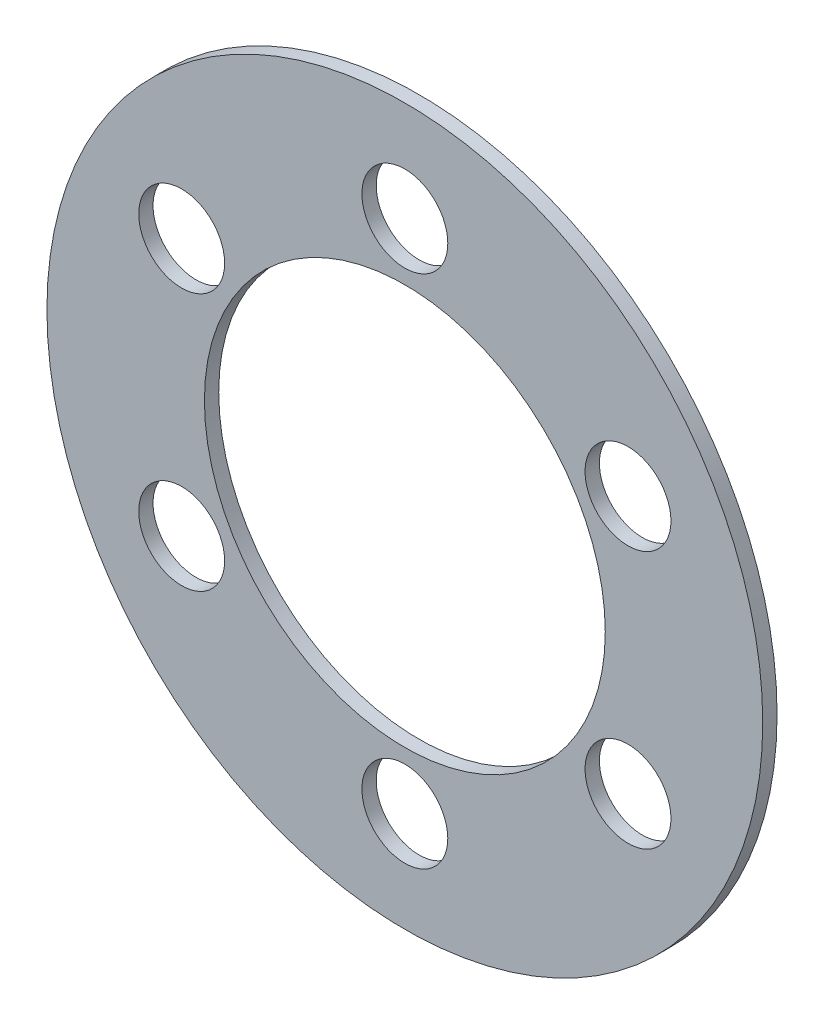
ISO-10303-21;
HEADER;
FILE_DESCRIPTION(('STEP AP214'),'2;1');
FILE_NAME('part.step','',(''),(''),'','','');
FILE_SCHEMA(('AUTOMOTIVE_DESIGN { 1 0 10303 214 1 1 1 1 }'));
ENDSEC;
DATA;
#1=APPLICATION_CONTEXT('core data for automotive mechanical design processes');
#2=APPLICATION_PROTOCOL_DEFINITION('international standard','automotive_design',2000,#1);
#3=PRODUCT_CONTEXT('',#1,'mechanical');
#4=PRODUCT('Part','Part','',(#3));
#5=PRODUCT_RELATED_PRODUCT_CATEGORY('part','',(#4));
#6=PRODUCT_DEFINITION_FORMATION('','',#4);
#7=PRODUCT_DEFINITION_CONTEXT('part definition',#1,'design');
#8=PRODUCT_DEFINITION('design','',#6,#7);
#9=PRODUCT_DEFINITION_SHAPE('','',#8);
#10=(LENGTH_UNIT() NAMED_UNIT(*) SI_UNIT(.MILLI.,.METRE.));
#11=(NAMED_UNIT(*) PLANE_ANGLE_UNIT() SI_UNIT($,.RADIAN.));
#12=(NAMED_UNIT(*) SI_UNIT($,.STERADIAN.) SOLID_ANGLE_UNIT());
#13=UNCERTAINTY_MEASURE_WITH_UNIT(LENGTH_MEASURE(1.E-05),#10,'distance_accuracy_value','');
#14=(GEOMETRIC_REPRESENTATION_CONTEXT(3) GLOBAL_UNCERTAINTY_ASSIGNED_CONTEXT((#13)) GLOBAL_UNIT_ASSIGNED_CONTEXT((#10,
#11,#12)) REPRESENTATION_CONTEXT('',''));
#15=CARTESIAN_POINT('',(0.,0.,0.));
#16=DIRECTION('',(0.,0.,1.));
#17=DIRECTION('',(1.,0.,0.));
#18=AXIS2_PLACEMENT_3D('',#15,#16,#17);
#19=CARTESIAN_POINT('',(0.,0.,0.5));
#20=DIRECTION('',(0.,0.,1.));
#21=DIRECTION('',(1.,0.,0.));
#22=AXIS2_PLACEMENT_3D('',#19,#20,#21);
#23=PLANE('',#22);
#24=CARTESIAN_POINT('',(-7.79422863405994,-4.5,0.5));
#25=DIRECTION('',(0.,0.,1.));
#26=DIRECTION('',(1.,0.,0.));
#27=AXIS2_PLACEMENT_3D('',#24,#25,#26);
#28=CIRCLE('',#27,1.50000000000008);
#29=CARTESIAN_POINT('',(-6.29422863405986,-4.5,0.5));
#30=VERTEX_POINT('',#29);
#31=EDGE_CURVE('E75',#30,#30,#28,.T.);
#32=ORIENTED_EDGE('',*,*,#31,.F.);
#33=EDGE_LOOP('',(#32));
#34=FACE_BOUND('',#33,.T.);
#35=CARTESIAN_POINT('',(7.79422863405995,-4.5,0.5));
#36=DIRECTION('',(0.,0.,1.));
#37=DIRECTION('',(1.,0.,0.));
#38=AXIS2_PLACEMENT_3D('',#35,#36,#37);
#39=CIRCLE('',#38,1.50000000000004);
#40=CARTESIAN_POINT('',(9.29422863405999,-4.5,0.5));
#41=VERTEX_POINT('',#40);
#42=EDGE_CURVE('E63',#41,#41,#39,.T.);
#43=ORIENTED_EDGE('',*,*,#42,.F.);
#44=EDGE_LOOP('',(#43));
#45=FACE_BOUND('',#44,.T.);
#46=CARTESIAN_POINT('',(0.,9.,0.5));
#47=DIRECTION('',(0.,0.,1.));
#48=DIRECTION('',(1.,0.,0.));
#49=AXIS2_PLACEMENT_3D('',#46,#47,#48);
#50=CIRCLE('',#49,1.5);
#51=CARTESIAN_POINT('',(1.5,9.,0.5));
#52=VERTEX_POINT('',#51);
#53=EDGE_CURVE('E51',#52,#52,#50,.T.);
#54=ORIENTED_EDGE('',*,*,#53,.F.);
#55=EDGE_LOOP('',(#54));
#56=FACE_BOUND('',#55,.T.);
#57=CARTESIAN_POINT('',(0.,0.,0.5));
#58=DIRECTION('',(0.,0.,1.));
#59=DIRECTION('',(1.,0.,0.));
#60=AXIS2_PLACEMENT_3D('',#57,#58,#59);
#61=CIRCLE('',#60,12.5);
#62=CARTESIAN_POINT('',(12.5,0.,0.5));
#63=VERTEX_POINT('',#62);
#64=EDGE_CURVE('E10',#63,#63,#61,.T.);
#65=ORIENTED_EDGE('',*,*,#64,.T.);
#66=EDGE_LOOP('',(#65));
#67=FACE_BOUND('',#66,.T.);
#68=CARTESIAN_POINT('',(0.,0.,0.5));
#69=DIRECTION('',(0.,0.,1.));
#70=DIRECTION('',(1.,0.,0.));
#71=AXIS2_PLACEMENT_3D('',#68,#69,#70);
#72=CIRCLE('',#71,7.);
#73=CARTESIAN_POINT('',(7.,0.,0.5));
#74=VERTEX_POINT('',#73);
#75=EDGE_CURVE('E46',#74,#74,#72,.T.);
#76=ORIENTED_EDGE('',*,*,#75,.F.);
#77=EDGE_LOOP('',(#76));
#78=FACE_BOUND('',#77,.T.);
#79=CARTESIAN_POINT('',(7.79422863405995,4.5,0.5));
#80=DIRECTION('',(0.,0.,1.));
#81=DIRECTION('',(1.,0.,0.));
#82=AXIS2_PLACEMENT_3D('',#79,#80,#81);
#83=CIRCLE('',#82,1.50000000000002);
#84=CARTESIAN_POINT('',(9.29422863405997,4.5,0.5));
#85=VERTEX_POINT('',#84);
#86=EDGE_CURVE('E57',#85,#85,#83,.T.);
#87=ORIENTED_EDGE('',*,*,#86,.F.);
#88=EDGE_LOOP('',(#87));
#89=FACE_BOUND('',#88,.T.);
#90=CARTESIAN_POINT('',(0.,-9.,0.5));
#91=DIRECTION('',(0.,0.,1.));
#92=DIRECTION('',(1.,0.,0.));
#93=AXIS2_PLACEMENT_3D('',#90,#91,#92);
#94=CIRCLE('',#93,1.50000000000006);
#95=CARTESIAN_POINT('',(1.50000000000006,-9.,0.5));
#96=VERTEX_POINT('',#95);
#97=EDGE_CURVE('E69',#96,#96,#94,.T.);
#98=ORIENTED_EDGE('',*,*,#97,.F.);
#99=EDGE_LOOP('',(#98));
#100=FACE_BOUND('',#99,.T.);
#101=CARTESIAN_POINT('',(-7.79422863405995,4.49999999999999,0.5));
#102=DIRECTION('',(0.,0.,1.));
#103=DIRECTION('',(1.,0.,0.));
#104=AXIS2_PLACEMENT_3D('',#101,#102,#103);
#105=CIRCLE('',#104,1.50000000000011);
#106=CARTESIAN_POINT('',(-6.29422863405984,4.49999999999999,0.5));
#107=VERTEX_POINT('',#106);
#108=EDGE_CURVE('E81',#107,#107,#105,.T.);
#109=ORIENTED_EDGE('',*,*,#108,.F.);
#110=EDGE_LOOP('',(#109));
#111=FACE_BOUND('',#110,.T.);
#112=ADVANCED_FACE('F35',(#34,#45,#56,#67,#78,#89,#100,#111),#23,.T.);
#113=CARTESIAN_POINT('',(0.,0.,0.));
#114=DIRECTION('',(0.,0.,1.));
#115=DIRECTION('',(1.,0.,0.));
#116=AXIS2_PLACEMENT_3D('',#113,#114,#115);
#117=PLANE('',#116);
#118=CARTESIAN_POINT('',(0.,0.,0.));
#119=DIRECTION('',(0.,0.,1.));
#120=DIRECTION('',(1.,0.,0.));
#121=AXIS2_PLACEMENT_3D('',#118,#119,#120);
#122=CIRCLE('',#121,12.5);
#123=CARTESIAN_POINT('',(12.5,0.,0.));
#124=VERTEX_POINT('',#123);
#125=EDGE_CURVE('E39',#124,#124,#122,.T.);
#126=ORIENTED_EDGE('',*,*,#125,.F.);
#127=EDGE_LOOP('',(#126));
#128=FACE_BOUND('',#127,.T.);
#129=CARTESIAN_POINT('',(0.,0.,0.));
#130=DIRECTION('',(0.,0.,1.));
#131=DIRECTION('',(1.,0.,0.));
#132=AXIS2_PLACEMENT_3D('',#129,#130,#131);
#133=CIRCLE('',#132,7.);
#134=CARTESIAN_POINT('',(7.,0.,0.));
#135=VERTEX_POINT('',#134);
#136=EDGE_CURVE('E48',#135,#135,#133,.T.);
#137=ORIENTED_EDGE('',*,*,#136,.T.);
#138=EDGE_LOOP('',(#137));
#139=FACE_BOUND('',#138,.T.);
#140=CARTESIAN_POINT('',(0.,9.,0.));
#141=DIRECTION('',(0.,0.,1.));
#142=DIRECTION('',(1.,0.,0.));
#143=AXIS2_PLACEMENT_3D('',#140,#141,#142);
#144=CIRCLE('',#143,1.5);
#145=CARTESIAN_POINT('',(1.5,9.,0.));
#146=VERTEX_POINT('',#145);
#147=EDGE_CURVE('E54',#146,#146,#144,.T.);
#148=ORIENTED_EDGE('',*,*,#147,.T.);
#149=EDGE_LOOP('',(#148));
#150=FACE_BOUND('',#149,.T.);
#151=CARTESIAN_POINT('',(7.79422863405995,4.5,0.));
#152=DIRECTION('',(0.,0.,1.));
#153=DIRECTION('',(1.,0.,0.));
#154=AXIS2_PLACEMENT_3D('',#151,#152,#153);
#155=CIRCLE('',#154,1.50000000000002);
#156=CARTESIAN_POINT('',(9.29422863405997,4.5,0.));
#157=VERTEX_POINT('',#156);
#158=EDGE_CURVE('E60',#157,#157,#155,.T.);
#159=ORIENTED_EDGE('',*,*,#158,.T.);
#160=EDGE_LOOP('',(#159));
#161=FACE_BOUND('',#160,.T.);
#162=CARTESIAN_POINT('',(7.79422863405995,-4.5,0.));
#163=DIRECTION('',(0.,0.,1.));
#164=DIRECTION('',(1.,0.,0.));
#165=AXIS2_PLACEMENT_3D('',#162,#163,#164);
#166=CIRCLE('',#165,1.50000000000004);
#167=CARTESIAN_POINT('',(9.29422863405999,-4.5,0.));
#168=VERTEX_POINT('',#167);
#169=EDGE_CURVE('E66',#168,#168,#166,.T.);
#170=ORIENTED_EDGE('',*,*,#169,.T.);
#171=EDGE_LOOP('',(#170));
#172=FACE_BOUND('',#171,.T.);
#173=CARTESIAN_POINT('',(0.,-9.,0.));
#174=DIRECTION('',(0.,0.,1.));
#175=DIRECTION('',(1.,0.,0.));
#176=AXIS2_PLACEMENT_3D('',#173,#174,#175);
#177=CIRCLE('',#176,1.50000000000006);
#178=CARTESIAN_POINT('',(1.50000000000006,-9.,0.));
#179=VERTEX_POINT('',#178);
#180=EDGE_CURVE('E72',#179,#179,#177,.T.);
#181=ORIENTED_EDGE('',*,*,#180,.T.);
#182=EDGE_LOOP('',(#181));
#183=FACE_BOUND('',#182,.T.);
#184=CARTESIAN_POINT('',(-7.79422863405994,-4.5,0.));
#185=DIRECTION('',(0.,0.,1.));
#186=DIRECTION('',(1.,0.,0.));
#187=AXIS2_PLACEMENT_3D('',#184,#185,#186);
#188=CIRCLE('',#187,1.50000000000008);
#189=CARTESIAN_POINT('',(-6.29422863405986,-4.5,0.));
#190=VERTEX_POINT('',#189);
#191=EDGE_CURVE('E78',#190,#190,#188,.T.);
#192=ORIENTED_EDGE('',*,*,#191,.T.);
#193=EDGE_LOOP('',(#192));
#194=FACE_BOUND('',#193,.T.);
#195=CARTESIAN_POINT('',(-7.79422863405995,4.49999999999999,0.));
#196=DIRECTION('',(0.,0.,1.));
#197=DIRECTION('',(1.,0.,0.));
#198=AXIS2_PLACEMENT_3D('',#195,#196,#197);
#199=CIRCLE('',#198,1.50000000000011);
#200=CARTESIAN_POINT('',(-6.29422863405984,4.49999999999999,0.));
#201=VERTEX_POINT('',#200);
#202=EDGE_CURVE('E84',#201,#201,#199,.T.);
#203=ORIENTED_EDGE('',*,*,#202,.T.);
#204=EDGE_LOOP('',(#203));
#205=FACE_BOUND('',#204,.T.);
#206=ADVANCED_FACE('F94',(#128,#139,#150,#161,#172,#183,#194,#205),#117,.F.);
#207=CARTESIAN_POINT('',(0.,0.,0.5));
#208=DIRECTION('',(0.,0.,-1.));
#209=DIRECTION('',(-1.,0.,0.));
#210=AXIS2_PLACEMENT_3D('',#207,#208,#209);
#211=CYLINDRICAL_SURFACE('',#210,12.5);
#212=ORIENTED_EDGE('',*,*,#64,.F.);
#213=EDGE_LOOP('',(#212));
#214=FACE_BOUND('',#213,.T.);
#215=ORIENTED_EDGE('',*,*,#125,.T.);
#216=EDGE_LOOP('',(#215));
#217=FACE_BOUND('',#216,.T.);
#218=ADVANCED_FACE('F37',(#214,#217),#211,.T.);
#219=CARTESIAN_POINT('',(0.,0.,0.5));
#220=DIRECTION('',(0.,0.,-1.));
#221=DIRECTION('',(-1.,0.,0.));
#222=AXIS2_PLACEMENT_3D('',#219,#220,#221);
#223=CYLINDRICAL_SURFACE('',#222,7.);
#224=ORIENTED_EDGE('',*,*,#75,.T.);
#225=EDGE_LOOP('',(#224));
#226=FACE_BOUND('',#225,.T.);
#227=ORIENTED_EDGE('',*,*,#136,.F.);
#228=EDGE_LOOP('',(#227));
#229=FACE_BOUND('',#228,.T.);
#230=ADVANCED_FACE('F104',(#226,#229),#223,.F.);
#231=CARTESIAN_POINT('',(0.,9.,0.5));
#232=DIRECTION('',(0.,0.,-1.));
#233=DIRECTION('',(-1.,0.,0.));
#234=AXIS2_PLACEMENT_3D('',#231,#232,#233);
#235=CYLINDRICAL_SURFACE('',#234,1.5);
#236=ORIENTED_EDGE('',*,*,#53,.T.);
#237=EDGE_LOOP('',(#236));
#238=FACE_BOUND('',#237,.T.);
#239=ORIENTED_EDGE('',*,*,#147,.F.);
#240=EDGE_LOOP('',(#239));
#241=FACE_BOUND('',#240,.T.);
#242=ADVANCED_FACE('F107',(#238,#241),#235,.F.);
#243=CARTESIAN_POINT('',(7.79422863405995,4.5,0.5));
#244=DIRECTION('',(0.,0.,-1.));
#245=DIRECTION('',(-1.,0.,0.));
#246=AXIS2_PLACEMENT_3D('',#243,#244,#245);
#247=CYLINDRICAL_SURFACE('',#246,1.50000000000002);
#248=ORIENTED_EDGE('',*,*,#86,.T.);
#249=EDGE_LOOP('',(#248));
#250=FACE_BOUND('',#249,.T.);
#251=ORIENTED_EDGE('',*,*,#158,.F.);
#252=EDGE_LOOP('',(#251));
#253=FACE_BOUND('',#252,.T.);
#254=ADVANCED_FACE('F111',(#250,#253),#247,.F.);
#255=CARTESIAN_POINT('',(7.79422863405995,-4.5,0.5));
#256=DIRECTION('',(0.,0.,-1.));
#257=DIRECTION('',(-1.,0.,0.));
#258=AXIS2_PLACEMENT_3D('',#255,#256,#257);
#259=CYLINDRICAL_SURFACE('',#258,1.50000000000004);
#260=ORIENTED_EDGE('',*,*,#42,.T.);
#261=EDGE_LOOP('',(#260));
#262=FACE_BOUND('',#261,.T.);
#263=ORIENTED_EDGE('',*,*,#169,.F.);
#264=EDGE_LOOP('',(#263));
#265=FACE_BOUND('',#264,.T.);
#266=ADVANCED_FACE('F115',(#262,#265),#259,.F.);
#267=CARTESIAN_POINT('',(0.,-9.,0.5));
#268=DIRECTION('',(0.,0.,-1.));
#269=DIRECTION('',(-1.,0.,0.));
#270=AXIS2_PLACEMENT_3D('',#267,#268,#269);
#271=CYLINDRICAL_SURFACE('',#270,1.50000000000006);
#272=ORIENTED_EDGE('',*,*,#97,.T.);
#273=EDGE_LOOP('',(#272));
#274=FACE_BOUND('',#273,.T.);
#275=ORIENTED_EDGE('',*,*,#180,.F.);
#276=EDGE_LOOP('',(#275));
#277=FACE_BOUND('',#276,.T.);
#278=ADVANCED_FACE('F119',(#274,#277),#271,.F.);
#279=CARTESIAN_POINT('',(-7.79422863405994,-4.5,0.5));
#280=DIRECTION('',(0.,0.,-1.));
#281=DIRECTION('',(-1.,0.,0.));
#282=AXIS2_PLACEMENT_3D('',#279,#280,#281);
#283=CYLINDRICAL_SURFACE('',#282,1.50000000000008);
#284=ORIENTED_EDGE('',*,*,#31,.T.);
#285=EDGE_LOOP('',(#284));
#286=FACE_BOUND('',#285,.T.);
#287=ORIENTED_EDGE('',*,*,#191,.F.);
#288=EDGE_LOOP('',(#287));
#289=FACE_BOUND('',#288,.T.);
#290=ADVANCED_FACE('F123',(#286,#289),#283,.F.);
#291=CARTESIAN_POINT('',(-7.79422863405995,4.49999999999999,0.5));
#292=DIRECTION('',(0.,0.,-1.));
#293=DIRECTION('',(-1.,0.,0.));
#294=AXIS2_PLACEMENT_3D('',#291,#292,#293);
#295=CYLINDRICAL_SURFACE('',#294,1.50000000000011);
#296=ORIENTED_EDGE('',*,*,#108,.T.);
#297=EDGE_LOOP('',(#296));
#298=FACE_BOUND('',#297,.T.);
#299=ORIENTED_EDGE('',*,*,#202,.F.);
#300=EDGE_LOOP('',(#299));
#301=FACE_BOUND('',#300,.T.);
#302=ADVANCED_FACE('F90',(#298,#301),#295,.F.);
#303=CLOSED_SHELL('',(#112,#206,#218,#230,#242,#254,#266,#278,#290,#302));
#304=MANIFOLD_SOLID_BREP('B2',#303);
#305=ADVANCED_BREP_SHAPE_REPRESENTATION('',(#18,#304),#14);
#306=SHAPE_DEFINITION_REPRESENTATION(#9,#305);
ENDSEC;
END-ISO-10303-21;
